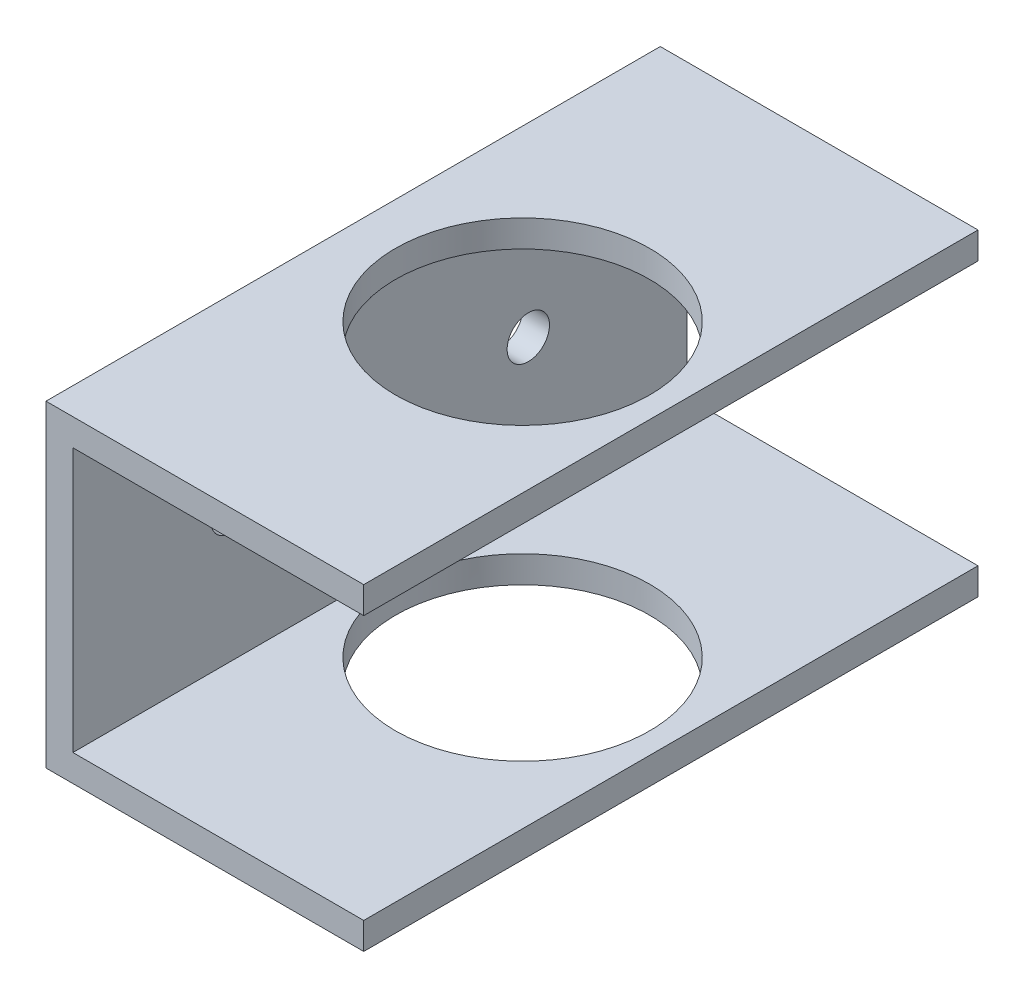
ISO-10303-21;
HEADER;
FILE_DESCRIPTION(('STEP AP214'),'2;1');
FILE_NAME('part.step','',(''),(''),'','','');
FILE_SCHEMA(('AUTOMOTIVE_DESIGN { 1 0 10303 214 1 1 1 1 }'));
ENDSEC;
DATA;
#1=APPLICATION_CONTEXT('core data for automotive mechanical design processes');
#2=APPLICATION_PROTOCOL_DEFINITION('international standard','automotive_design',2000,#1);
#3=PRODUCT_CONTEXT('',#1,'mechanical');
#4=PRODUCT('Part','Part','',(#3));
#5=PRODUCT_RELATED_PRODUCT_CATEGORY('part','',(#4));
#6=PRODUCT_DEFINITION_FORMATION('','',#4);
#7=PRODUCT_DEFINITION_CONTEXT('part definition',#1,'design');
#8=PRODUCT_DEFINITION('design','',#6,#7);
#9=PRODUCT_DEFINITION_SHAPE('','',#8);
#10=(LENGTH_UNIT() NAMED_UNIT(*) SI_UNIT(.MILLI.,.METRE.));
#11=(NAMED_UNIT(*) PLANE_ANGLE_UNIT() SI_UNIT($,.RADIAN.));
#12=(NAMED_UNIT(*) SI_UNIT($,.STERADIAN.) SOLID_ANGLE_UNIT());
#13=UNCERTAINTY_MEASURE_WITH_UNIT(LENGTH_MEASURE(1.E-05),#10,'distance_accuracy_value','');
#14=(GEOMETRIC_REPRESENTATION_CONTEXT(3) GLOBAL_UNCERTAINTY_ASSIGNED_CONTEXT((#13)) GLOBAL_UNIT_ASSIGNED_CONTEXT((#10,
#11,#12)) REPRESENTATION_CONTEXT('',''));
#15=CARTESIAN_POINT('',(0.,0.,0.));
#16=DIRECTION('',(0.,0.,1.));
#17=DIRECTION('',(1.,0.,0.));
#18=AXIS2_PLACEMENT_3D('',#15,#16,#17);
#19=CARTESIAN_POINT('',(75.,-37.5,145.));
#20=DIRECTION('',(0.,1.,0.));
#21=DIRECTION('',(0.,0.,1.));
#22=AXIS2_PLACEMENT_3D('',#19,#20,#21);
#23=PLANE('',#22);
#24=CARTESIAN_POINT('',(40.,-37.5,72.5));
#25=DIRECTION('',(0.,1.,0.));
#26=DIRECTION('',(0.,0.,1.));
#27=AXIS2_PLACEMENT_3D('',#24,#25,#26);
#28=CIRCLE('',#27,30.);
#29=CARTESIAN_POINT('',(40.,-37.5,102.5));
#30=VERTEX_POINT('',#29);
#31=EDGE_CURVE('E166',#30,#30,#28,.T.);
#32=ORIENTED_EDGE('',*,*,#31,.T.);
#33=EDGE_LOOP('',(#32));
#34=FACE_BOUND('',#33,.T.);
#35=DIRECTION('',(1.,0.,0.));
#36=VECTOR('',#35,1.);
#37=CARTESIAN_POINT('',(75.,-37.5,0.));
#38=LINE('',#37,#36);
#39=CARTESIAN_POINT('',(0.,-37.5,0.));
#40=VERTEX_POINT('',#39);
#41=CARTESIAN_POINT('',(75.,-37.5,0.));
#42=VERTEX_POINT('',#41);
#43=EDGE_CURVE('E133',#40,#42,#38,.T.);
#44=ORIENTED_EDGE('',*,*,#43,.T.);
#45=DIRECTION('',(0.,0.,-1.));
#46=VECTOR('',#45,1.);
#47=CARTESIAN_POINT('',(75.,-37.5,145.));
#48=LINE('',#47,#46);
#49=CARTESIAN_POINT('',(75.,-37.5,145.));
#50=VERTEX_POINT('',#49);
#51=EDGE_CURVE('E11',#50,#42,#48,.T.);
#52=ORIENTED_EDGE('',*,*,#51,.F.);
#53=DIRECTION('',(1.,0.,0.));
#54=VECTOR('',#53,1.);
#55=CARTESIAN_POINT('',(75.,-37.5,145.));
#56=LINE('',#55,#54);
#57=CARTESIAN_POINT('',(0.,-37.5,145.));
#58=VERTEX_POINT('',#57);
#59=EDGE_CURVE('E148',#58,#50,#56,.T.);
#60=ORIENTED_EDGE('',*,*,#59,.F.);
#61=DIRECTION('',(0.,0.,-1.));
#62=VECTOR('',#61,1.);
#63=CARTESIAN_POINT('',(0.,-37.5,145.));
#64=LINE('',#63,#62);
#65=EDGE_CURVE('E129',#58,#40,#64,.T.);
#66=ORIENTED_EDGE('',*,*,#65,.T.);
#67=EDGE_LOOP('',(#44,#52,#60,#66));
#68=FACE_BOUND('',#67,.T.);
#69=ADVANCED_FACE('F35',(#34,#68),#23,.F.);
#70=CARTESIAN_POINT('',(75.,-31.15,145.));
#71=DIRECTION('',(-1.,0.,0.));
#72=DIRECTION('',(0.,-1.,0.));
#73=AXIS2_PLACEMENT_3D('',#70,#71,#72);
#74=PLANE('',#73);
#75=DIRECTION('',(0.,1.,0.));
#76=VECTOR('',#75,1.);
#77=CARTESIAN_POINT('',(75.,-31.15,0.));
#78=LINE('',#77,#76);
#79=CARTESIAN_POINT('',(75.,-31.15,0.));
#80=VERTEX_POINT('',#79);
#81=EDGE_CURVE('E136',#42,#80,#78,.T.);
#82=ORIENTED_EDGE('',*,*,#81,.T.);
#83=DIRECTION('',(0.,0.,-1.));
#84=VECTOR('',#83,1.);
#85=CARTESIAN_POINT('',(75.,-31.15,145.));
#86=LINE('',#85,#84);
#87=CARTESIAN_POINT('',(75.,-31.15,145.));
#88=VERTEX_POINT('',#87);
#89=EDGE_CURVE('E44',#88,#80,#86,.T.);
#90=ORIENTED_EDGE('',*,*,#89,.F.);
#91=DIRECTION('',(0.,1.,0.));
#92=VECTOR('',#91,1.);
#93=CARTESIAN_POINT('',(75.,-31.15,145.));
#94=LINE('',#93,#92);
#95=EDGE_CURVE('E96',#50,#88,#94,.T.);
#96=ORIENTED_EDGE('',*,*,#95,.F.);
#97=ORIENTED_EDGE('',*,*,#51,.T.);
#98=EDGE_LOOP('',(#82,#90,#96,#97));
#99=FACE_BOUND('',#98,.T.);
#100=ADVANCED_FACE('F220',(#99),#74,.F.);
#101=CARTESIAN_POINT('',(6.35000000000001,-31.15,145.));
#102=DIRECTION('',(0.,-1.,0.));
#103=DIRECTION('',(0.,0.,-1.));
#104=AXIS2_PLACEMENT_3D('',#101,#102,#103);
#105=PLANE('',#104);
#106=CARTESIAN_POINT('',(40.,-31.15,72.5));
#107=DIRECTION('',(0.,-1.,0.));
#108=DIRECTION('',(0.,0.,-1.));
#109=AXIS2_PLACEMENT_3D('',#106,#107,#108);
#110=CIRCLE('',#109,30.);
#111=CARTESIAN_POINT('',(40.,-31.15,42.5));
#112=VERTEX_POINT('',#111);
#113=EDGE_CURVE('E137',#112,#112,#110,.T.);
#114=ORIENTED_EDGE('',*,*,#113,.T.);
#115=EDGE_LOOP('',(#114));
#116=FACE_BOUND('',#115,.T.);
#117=DIRECTION('',(-1.,0.,0.));
#118=VECTOR('',#117,1.);
#119=CARTESIAN_POINT('',(6.35000000000001,-31.15,0.));
#120=LINE('',#119,#118);
#121=CARTESIAN_POINT('',(6.35000000000001,-31.15,0.));
#122=VERTEX_POINT('',#121);
#123=EDGE_CURVE('E139',#80,#122,#120,.T.);
#124=ORIENTED_EDGE('',*,*,#123,.T.);
#125=DIRECTION('',(0.,0.,-1.));
#126=VECTOR('',#125,1.);
#127=CARTESIAN_POINT('',(6.35000000000001,-31.15,145.));
#128=LINE('',#127,#126);
#129=CARTESIAN_POINT('',(6.35000000000001,-31.15,145.));
#130=VERTEX_POINT('',#129);
#131=EDGE_CURVE('E155',#130,#122,#128,.T.);
#132=ORIENTED_EDGE('',*,*,#131,.F.);
#133=DIRECTION('',(-1.,0.,0.));
#134=VECTOR('',#133,1.);
#135=CARTESIAN_POINT('',(6.35000000000001,-31.15,145.));
#136=LINE('',#135,#134);
#137=EDGE_CURVE('E185',#88,#130,#136,.T.);
#138=ORIENTED_EDGE('',*,*,#137,.F.);
#139=ORIENTED_EDGE('',*,*,#89,.T.);
#140=EDGE_LOOP('',(#124,#132,#138,#139));
#141=FACE_BOUND('',#140,.T.);
#142=ADVANCED_FACE('F225',(#116,#141),#105,.F.);
#143=CARTESIAN_POINT('',(6.35000000000001,31.15,145.));
#144=DIRECTION('',(-1.,0.,0.));
#145=DIRECTION('',(0.,0.,1.));
#146=AXIS2_PLACEMENT_3D('',#143,#144,#145);
#147=PLANE('',#146);
#148=CARTESIAN_POINT('',(6.35000000000001,0.,37.5));
#149=DIRECTION('',(1.,0.,0.));
#150=DIRECTION('',(0.,0.,-1.));
#151=AXIS2_PLACEMENT_3D('',#148,#149,#150);
#152=CIRCLE('',#151,5.);
#153=CARTESIAN_POINT('',(6.35000000000001,0.,32.5));
#154=VERTEX_POINT('',#153);
#155=EDGE_CURVE('E173',#154,#154,#152,.T.);
#156=ORIENTED_EDGE('',*,*,#155,.F.);
#157=EDGE_LOOP('',(#156));
#158=FACE_BOUND('',#157,.T.);
#159=CARTESIAN_POINT('',(6.35000000000001,0.,107.5));
#160=DIRECTION('',(1.,0.,0.));
#161=DIRECTION('',(0.,0.,-1.));
#162=AXIS2_PLACEMENT_3D('',#159,#160,#161);
#163=CIRCLE('',#162,5.);
#164=CARTESIAN_POINT('',(6.35000000000001,0.,102.5));
#165=VERTEX_POINT('',#164);
#166=EDGE_CURVE('E162',#165,#165,#163,.T.);
#167=ORIENTED_EDGE('',*,*,#166,.F.);
#168=EDGE_LOOP('',(#167));
#169=FACE_BOUND('',#168,.T.);
#170=DIRECTION('',(0.,1.,0.));
#171=VECTOR('',#170,1.);
#172=CARTESIAN_POINT('',(6.35000000000001,31.15,0.));
#173=LINE('',#172,#171);
#174=CARTESIAN_POINT('',(6.35000000000001,31.15,0.));
#175=VERTEX_POINT('',#174);
#176=EDGE_CURVE('E141',#122,#175,#173,.T.);
#177=ORIENTED_EDGE('',*,*,#176,.T.);
#178=DIRECTION('',(0.,0.,-1.));
#179=VECTOR('',#178,1.);
#180=CARTESIAN_POINT('',(6.35000000000001,31.15,145.));
#181=LINE('',#180,#179);
#182=CARTESIAN_POINT('',(6.35000000000001,31.15,145.));
#183=VERTEX_POINT('',#182);
#184=EDGE_CURVE('E152',#183,#175,#181,.T.);
#185=ORIENTED_EDGE('',*,*,#184,.F.);
#186=DIRECTION('',(0.,1.,0.));
#187=VECTOR('',#186,1.);
#188=CARTESIAN_POINT('',(6.35000000000001,31.15,145.));
#189=LINE('',#188,#187);
#190=EDGE_CURVE('E187',#130,#183,#189,.T.);
#191=ORIENTED_EDGE('',*,*,#190,.F.);
#192=ORIENTED_EDGE('',*,*,#131,.T.);
#193=EDGE_LOOP('',(#177,#185,#191,#192));
#194=FACE_BOUND('',#193,.T.);
#195=ADVANCED_FACE('F193',(#158,#169,#194),#147,.F.);
#196=CARTESIAN_POINT('',(75.,31.15,145.));
#197=DIRECTION('',(0.,1.,0.));
#198=DIRECTION('',(0.,0.,1.));
#199=AXIS2_PLACEMENT_3D('',#196,#197,#198);
#200=PLANE('',#199);
#201=CARTESIAN_POINT('',(40.,31.15,72.5));
#202=DIRECTION('',(0.,1.,0.));
#203=DIRECTION('',(0.,0.,1.));
#204=AXIS2_PLACEMENT_3D('',#201,#202,#203);
#205=CIRCLE('',#204,30.);
#206=CARTESIAN_POINT('',(40.,31.15,102.5));
#207=VERTEX_POINT('',#206);
#208=EDGE_CURVE('E177',#207,#207,#205,.T.);
#209=ORIENTED_EDGE('',*,*,#208,.T.);
#210=EDGE_LOOP('',(#209));
#211=FACE_BOUND('',#210,.T.);
#212=DIRECTION('',(1.,0.,0.));
#213=VECTOR('',#212,1.);
#214=CARTESIAN_POINT('',(75.,31.15,0.));
#215=LINE('',#214,#213);
#216=CARTESIAN_POINT('',(75.,31.15,0.));
#217=VERTEX_POINT('',#216);
#218=EDGE_CURVE('E143',#175,#217,#215,.T.);
#219=ORIENTED_EDGE('',*,*,#218,.T.);
#220=DIRECTION('',(0.,0.,-1.));
#221=VECTOR('',#220,1.);
#222=CARTESIAN_POINT('',(75.,31.15,145.));
#223=LINE('',#222,#221);
#224=CARTESIAN_POINT('',(75.,31.15,145.));
#225=VERTEX_POINT('',#224);
#226=EDGE_CURVE('E124',#225,#217,#223,.T.);
#227=ORIENTED_EDGE('',*,*,#226,.F.);
#228=DIRECTION('',(1.,0.,0.));
#229=VECTOR('',#228,1.);
#230=CARTESIAN_POINT('',(75.,31.15,145.));
#231=LINE('',#230,#229);
#232=EDGE_CURVE('E115',#183,#225,#231,.T.);
#233=ORIENTED_EDGE('',*,*,#232,.F.);
#234=ORIENTED_EDGE('',*,*,#184,.T.);
#235=EDGE_LOOP('',(#219,#227,#233,#234));
#236=FACE_BOUND('',#235,.T.);
#237=ADVANCED_FACE('F197',(#211,#236),#200,.F.);
#238=CARTESIAN_POINT('',(75.,37.5,145.));
#239=DIRECTION('',(-1.,0.,0.));
#240=DIRECTION('',(0.,-1.,0.));
#241=AXIS2_PLACEMENT_3D('',#238,#239,#240);
#242=PLANE('',#241);
#243=DIRECTION('',(0.,1.,0.));
#244=VECTOR('',#243,1.);
#245=CARTESIAN_POINT('',(75.,37.5,0.));
#246=LINE('',#245,#244);
#247=CARTESIAN_POINT('',(75.,37.5,0.));
#248=VERTEX_POINT('',#247);
#249=EDGE_CURVE('E123',#217,#248,#246,.T.);
#250=ORIENTED_EDGE('',*,*,#249,.T.);
#251=DIRECTION('',(0.,0.,-1.));
#252=VECTOR('',#251,1.);
#253=CARTESIAN_POINT('',(75.,37.5,145.));
#254=LINE('',#253,#252);
#255=CARTESIAN_POINT('',(75.,37.5,145.));
#256=VERTEX_POINT('',#255);
#257=EDGE_CURVE('E120',#256,#248,#254,.T.);
#258=ORIENTED_EDGE('',*,*,#257,.F.);
#259=DIRECTION('',(0.,1.,0.));
#260=VECTOR('',#259,1.);
#261=CARTESIAN_POINT('',(75.,37.5,145.));
#262=LINE('',#261,#260);
#263=EDGE_CURVE('E109',#225,#256,#262,.T.);
#264=ORIENTED_EDGE('',*,*,#263,.F.);
#265=ORIENTED_EDGE('',*,*,#226,.T.);
#266=EDGE_LOOP('',(#250,#258,#264,#265));
#267=FACE_BOUND('',#266,.T.);
#268=ADVANCED_FACE('F121',(#267),#242,.F.);
#269=CARTESIAN_POINT('',(0.,37.5,145.));
#270=DIRECTION('',(0.,-1.,0.));
#271=DIRECTION('',(0.,0.,-1.));
#272=AXIS2_PLACEMENT_3D('',#269,#270,#271);
#273=PLANE('',#272);
#274=CARTESIAN_POINT('',(40.,37.5,72.5));
#275=DIRECTION('',(0.,1.,0.));
#276=DIRECTION('',(0.,0.,1.));
#277=AXIS2_PLACEMENT_3D('',#274,#275,#276);
#278=CIRCLE('',#277,30.);
#279=CARTESIAN_POINT('',(40.,37.5,102.5));
#280=VERTEX_POINT('',#279);
#281=EDGE_CURVE('E161',#280,#280,#278,.T.);
#282=ORIENTED_EDGE('',*,*,#281,.F.);
#283=EDGE_LOOP('',(#282));
#284=FACE_BOUND('',#283,.T.);
#285=DIRECTION('',(-1.,0.,0.));
#286=VECTOR('',#285,1.);
#287=CARTESIAN_POINT('',(0.,37.5,0.));
#288=LINE('',#287,#286);
#289=CARTESIAN_POINT('',(0.,37.5,0.));
#290=VERTEX_POINT('',#289);
#291=EDGE_CURVE('E82',#248,#290,#288,.T.);
#292=ORIENTED_EDGE('',*,*,#291,.T.);
#293=DIRECTION('',(0.,0.,-1.));
#294=VECTOR('',#293,1.);
#295=CARTESIAN_POINT('',(0.,37.5,145.));
#296=LINE('',#295,#294);
#297=CARTESIAN_POINT('',(0.,37.5,145.));
#298=VERTEX_POINT('',#297);
#299=EDGE_CURVE('E125',#298,#290,#296,.T.);
#300=ORIENTED_EDGE('',*,*,#299,.F.);
#301=DIRECTION('',(-1.,0.,0.));
#302=VECTOR('',#301,1.);
#303=CARTESIAN_POINT('',(0.,37.5,145.));
#304=LINE('',#303,#302);
#305=EDGE_CURVE('E113',#256,#298,#304,.T.);
#306=ORIENTED_EDGE('',*,*,#305,.F.);
#307=ORIENTED_EDGE('',*,*,#257,.T.);
#308=EDGE_LOOP('',(#292,#300,#306,#307));
#309=FACE_BOUND('',#308,.T.);
#310=ADVANCED_FACE('F127',(#284,#309),#273,.F.);
#311=CARTESIAN_POINT('',(0.,-37.5,145.));
#312=DIRECTION('',(1.,0.,0.));
#313=DIRECTION('',(0.,0.,-1.));
#314=AXIS2_PLACEMENT_3D('',#311,#312,#313);
#315=PLANE('',#314);
#316=CARTESIAN_POINT('',(0.,0.,37.5));
#317=DIRECTION('',(1.,0.,0.));
#318=DIRECTION('',(0.,0.,-1.));
#319=AXIS2_PLACEMENT_3D('',#316,#317,#318);
#320=CIRCLE('',#319,5.);
#321=CARTESIAN_POINT('',(0.,0.,32.5));
#322=VERTEX_POINT('',#321);
#323=EDGE_CURVE('E38',#322,#322,#320,.T.);
#324=ORIENTED_EDGE('',*,*,#323,.T.);
#325=EDGE_LOOP('',(#324));
#326=FACE_BOUND('',#325,.T.);
#327=CARTESIAN_POINT('',(0.,0.,107.5));
#328=DIRECTION('',(1.,0.,0.));
#329=DIRECTION('',(0.,0.,-1.));
#330=AXIS2_PLACEMENT_3D('',#327,#328,#329);
#331=CIRCLE('',#330,5.);
#332=CARTESIAN_POINT('',(0.,0.,102.5));
#333=VERTEX_POINT('',#332);
#334=EDGE_CURVE('E159',#333,#333,#331,.T.);
#335=ORIENTED_EDGE('',*,*,#334,.T.);
#336=EDGE_LOOP('',(#335));
#337=FACE_BOUND('',#336,.T.);
#338=DIRECTION('',(0.,-1.,0.));
#339=VECTOR('',#338,1.);
#340=CARTESIAN_POINT('',(0.,-37.5,0.));
#341=LINE('',#340,#339);
#342=EDGE_CURVE('E88',#290,#40,#341,.T.);
#343=ORIENTED_EDGE('',*,*,#342,.T.);
#344=ORIENTED_EDGE('',*,*,#65,.F.);
#345=DIRECTION('',(0.,-1.,0.));
#346=VECTOR('',#345,1.);
#347=CARTESIAN_POINT('',(0.,-37.5,145.));
#348=LINE('',#347,#346);
#349=EDGE_CURVE('E53',#298,#58,#348,.T.);
#350=ORIENTED_EDGE('',*,*,#349,.F.);
#351=ORIENTED_EDGE('',*,*,#299,.T.);
#352=EDGE_LOOP('',(#343,#344,#350,#351));
#353=FACE_BOUND('',#352,.T.);
#354=ADVANCED_FACE('F205',(#326,#337,#353),#315,.F.);
#355=CARTESIAN_POINT('',(0.,0.,145.));
#356=DIRECTION('',(0.,0.,-1.));
#357=DIRECTION('',(-1.,0.,0.));
#358=AXIS2_PLACEMENT_3D('',#355,#356,#357);
#359=PLANE('',#358);
#360=ORIENTED_EDGE('',*,*,#59,.T.);
#361=ORIENTED_EDGE('',*,*,#95,.T.);
#362=ORIENTED_EDGE('',*,*,#137,.T.);
#363=ORIENTED_EDGE('',*,*,#190,.T.);
#364=ORIENTED_EDGE('',*,*,#232,.T.);
#365=ORIENTED_EDGE('',*,*,#263,.T.);
#366=ORIENTED_EDGE('',*,*,#305,.T.);
#367=ORIENTED_EDGE('',*,*,#349,.T.);
#368=EDGE_LOOP('',(#360,#361,#362,#363,#364,#365,#366,#367));
#369=FACE_BOUND('',#368,.T.);
#370=ADVANCED_FACE('F111',(#369),#359,.F.);
#371=CARTESIAN_POINT('',(0.,0.,0.));
#372=DIRECTION('',(0.,0.,-1.));
#373=DIRECTION('',(-1.,0.,0.));
#374=AXIS2_PLACEMENT_3D('',#371,#372,#373);
#375=PLANE('',#374);
#376=ORIENTED_EDGE('',*,*,#43,.F.);
#377=ORIENTED_EDGE('',*,*,#342,.F.);
#378=ORIENTED_EDGE('',*,*,#291,.F.);
#379=ORIENTED_EDGE('',*,*,#249,.F.);
#380=ORIENTED_EDGE('',*,*,#218,.F.);
#381=ORIENTED_EDGE('',*,*,#176,.F.);
#382=ORIENTED_EDGE('',*,*,#123,.F.);
#383=ORIENTED_EDGE('',*,*,#81,.F.);
#384=EDGE_LOOP('',(#376,#377,#378,#379,#380,#381,#382,#383));
#385=FACE_BOUND('',#384,.T.);
#386=ADVANCED_FACE('F200',(#385),#375,.T.);
#387=CARTESIAN_POINT('',(40.,-37.5,72.5));
#388=DIRECTION('',(0.,1.,0.));
#389=DIRECTION('',(0.,0.,1.));
#390=AXIS2_PLACEMENT_3D('',#387,#388,#389);
#391=CYLINDRICAL_SURFACE('',#390,30.);
#392=ORIENTED_EDGE('',*,*,#281,.T.);
#393=EDGE_LOOP('',(#392));
#394=FACE_BOUND('',#393,.T.);
#395=ORIENTED_EDGE('',*,*,#208,.F.);
#396=EDGE_LOOP('',(#395));
#397=FACE_BOUND('',#396,.T.);
#398=ADVANCED_FACE('F232',(#394,#397),#391,.F.);
#399=ORIENTED_EDGE('',*,*,#31,.F.);
#400=EDGE_LOOP('',(#399));
#401=FACE_BOUND('',#400,.T.);
#402=ORIENTED_EDGE('',*,*,#113,.F.);
#403=EDGE_LOOP('',(#402));
#404=FACE_BOUND('',#403,.T.);
#405=ADVANCED_FACE('F228',(#401,#404),#391,.F.);
#406=CARTESIAN_POINT('',(-3.64999999999999,0.,107.5));
#407=DIRECTION('',(1.,0.,0.));
#408=DIRECTION('',(0.,0.,-1.));
#409=AXIS2_PLACEMENT_3D('',#406,#407,#408);
#410=CYLINDRICAL_SURFACE('',#409,5.);
#411=ORIENTED_EDGE('',*,*,#166,.T.);
#412=EDGE_LOOP('',(#411));
#413=FACE_BOUND('',#412,.T.);
#414=ORIENTED_EDGE('',*,*,#334,.F.);
#415=EDGE_LOOP('',(#414));
#416=FACE_BOUND('',#415,.T.);
#417=ADVANCED_FACE('F231',(#413,#416),#410,.F.);
#418=CARTESIAN_POINT('',(-3.64999999999999,0.,37.5));
#419=DIRECTION('',(1.,0.,0.));
#420=DIRECTION('',(0.,0.,-1.));
#421=AXIS2_PLACEMENT_3D('',#418,#419,#420);
#422=CYLINDRICAL_SURFACE('',#421,5.);
#423=ORIENTED_EDGE('',*,*,#155,.T.);
#424=EDGE_LOOP('',(#423));
#425=FACE_BOUND('',#424,.T.);
#426=ORIENTED_EDGE('',*,*,#323,.F.);
#427=EDGE_LOOP('',(#426));
#428=FACE_BOUND('',#427,.T.);
#429=ADVANCED_FACE('F286',(#425,#428),#422,.F.);
#430=CLOSED_SHELL('',(#69,#100,#142,#195,#237,#268,#310,#354,#370,#386,#398,#405,#417,#429));
#431=MANIFOLD_SOLID_BREP('B2',#430);
#432=ADVANCED_BREP_SHAPE_REPRESENTATION('',(#18,#431),#14);
#433=SHAPE_DEFINITION_REPRESENTATION(#9,#432);
ENDSEC;
END-ISO-10303-21;
